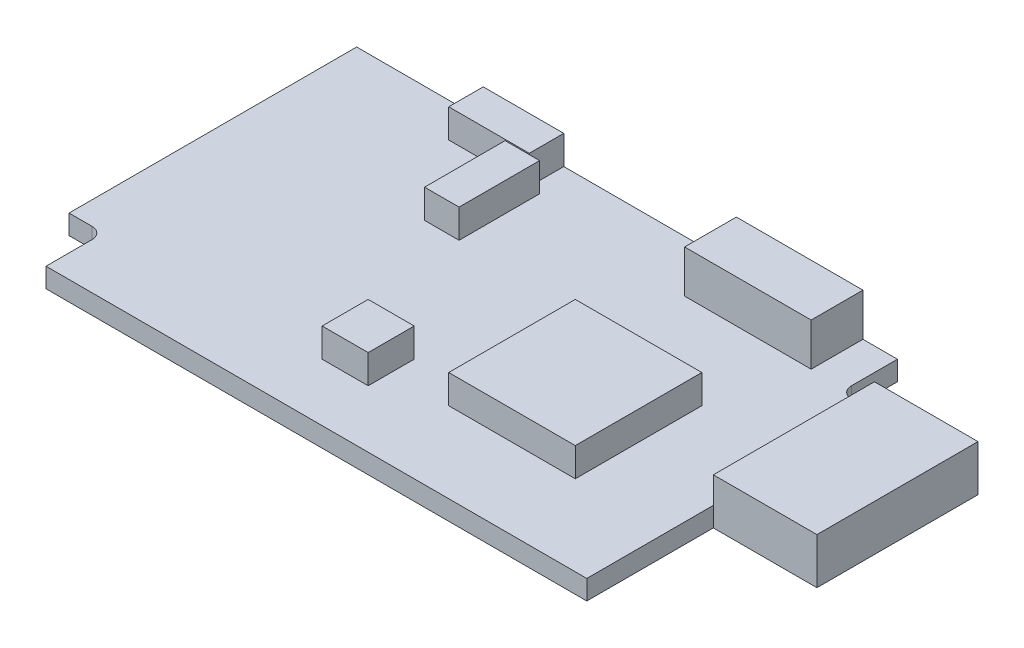
ISO-10303-21;
HEADER;
FILE_DESCRIPTION(('STEP AP214'),'2;1');
FILE_NAME('part.step','',(''),(''),'','','');
FILE_SCHEMA(('AUTOMOTIVE_DESIGN { 1 0 10303 214 1 1 1 1 }'));
ENDSEC;
DATA;
#1=APPLICATION_CONTEXT('core data for automotive mechanical design processes');
#2=APPLICATION_PROTOCOL_DEFINITION('international standard','automotive_design',2000,#1);
#3=PRODUCT_CONTEXT('',#1,'mechanical');
#4=PRODUCT('Part','Part','',(#3));
#5=PRODUCT_RELATED_PRODUCT_CATEGORY('part','',(#4));
#6=PRODUCT_DEFINITION_FORMATION('','',#4);
#7=PRODUCT_DEFINITION_CONTEXT('part definition',#1,'design');
#8=PRODUCT_DEFINITION('design','',#6,#7);
#9=PRODUCT_DEFINITION_SHAPE('','',#8);
#10=(LENGTH_UNIT() NAMED_UNIT(*) SI_UNIT(.MILLI.,.METRE.));
#11=(NAMED_UNIT(*) PLANE_ANGLE_UNIT() SI_UNIT($,.RADIAN.));
#12=(NAMED_UNIT(*) SI_UNIT($,.STERADIAN.) SOLID_ANGLE_UNIT());
#13=UNCERTAINTY_MEASURE_WITH_UNIT(LENGTH_MEASURE(1.E-05),#10,'distance_accuracy_value','');
#14=(GEOMETRIC_REPRESENTATION_CONTEXT(3) GLOBAL_UNCERTAINTY_ASSIGNED_CONTEXT((#13)) GLOBAL_UNIT_ASSIGNED_CONTEXT((#10,
#11,#12)) REPRESENTATION_CONTEXT('',''));
#15=CARTESIAN_POINT('',(0.,0.,0.));
#16=DIRECTION('',(0.,0.,1.));
#17=DIRECTION('',(1.,0.,0.));
#18=AXIS2_PLACEMENT_3D('',#15,#16,#17);
#19=CARTESIAN_POINT('',(50.,1.7,0.));
#20=DIRECTION('',(-1.,0.,0.));
#21=DIRECTION('',(0.,0.,1.));
#22=AXIS2_PLACEMENT_3D('',#19,#20,#21);
#23=PLANE('',#22);
#24=DIRECTION('',(0.,-1.,0.));
#25=VECTOR('',#24,1.);
#26=CARTESIAN_POINT('',(50.,0.,-11.));
#27=LINE('',#26,#25);
#28=CARTESIAN_POINT('',(50.,1.7,-11.));
#29=VERTEX_POINT('',#28);
#30=CARTESIAN_POINT('',(50.,0.,-11.));
#31=VERTEX_POINT('',#30);
#32=EDGE_CURVE('E11',#29,#31,#27,.T.);
#33=ORIENTED_EDGE('',*,*,#32,.F.);
#34=DIRECTION('',(0.,0.,-1.));
#35=VECTOR('',#34,1.);
#36=CARTESIAN_POINT('',(50.,1.7,0.));
#37=LINE('',#36,#35);
#38=CARTESIAN_POINT('',(50.,1.7,0.));
#39=VERTEX_POINT('',#38);
#40=EDGE_CURVE('E293',#39,#29,#37,.T.);
#41=ORIENTED_EDGE('',*,*,#40,.F.);
#42=DIRECTION('',(0.,-1.,0.));
#43=VECTOR('',#42,1.);
#44=CARTESIAN_POINT('',(50.,1.7,0.));
#45=LINE('',#44,#43);
#46=CARTESIAN_POINT('',(50.,0.,0.));
#47=VERTEX_POINT('',#46);
#48=EDGE_CURVE('E366',#39,#47,#45,.T.);
#49=ORIENTED_EDGE('',*,*,#48,.T.);
#50=DIRECTION('',(0.,0.,-1.));
#51=VECTOR('',#50,1.);
#52=CARTESIAN_POINT('',(50.,0.,0.));
#53=LINE('',#52,#51);
#54=EDGE_CURVE('E316',#47,#31,#53,.T.);
#55=ORIENTED_EDGE('',*,*,#54,.T.);
#56=EDGE_LOOP('',(#33,#41,#49,#55));
#57=FACE_BOUND('',#56,.T.);
#58=ADVANCED_FACE('F35',(#57),#23,.F.);
#59=CARTESIAN_POINT('',(47.,1.7,-30.));
#60=DIRECTION('',(0.,-1.,0.));
#61=DIRECTION('',(0.,0.,-1.));
#62=AXIS2_PLACEMENT_3D('',#59,#60,#61);
#63=PLANE('',#62);
#64=DIRECTION('',(0.,0.,1.));
#65=VECTOR('',#64,1.);
#66=CARTESIAN_POINT('',(31.,1.7,-18.));
#67=LINE('',#66,#65);
#68=CARTESIAN_POINT('',(31.,1.7,-18.));
#69=VERTEX_POINT('',#68);
#70=CARTESIAN_POINT('',(31.,1.7,-7.));
#71=VERTEX_POINT('',#70);
#72=EDGE_CURVE('E398',#69,#71,#67,.T.);
#73=ORIENTED_EDGE('',*,*,#72,.F.);
#74=DIRECTION('',(-1.,0.,0.));
#75=VECTOR('',#74,1.);
#76=CARTESIAN_POINT('',(31.,1.7,-18.));
#77=LINE('',#76,#75);
#78=CARTESIAN_POINT('',(42.,1.7,-18.));
#79=VERTEX_POINT('',#78);
#80=EDGE_CURVE('E425',#79,#69,#77,.T.);
#81=ORIENTED_EDGE('',*,*,#80,.F.);
#82=DIRECTION('',(0.,0.,-1.));
#83=VECTOR('',#82,1.);
#84=CARTESIAN_POINT('',(42.,1.7,-18.));
#85=LINE('',#84,#83);
#86=CARTESIAN_POINT('',(42.,1.7,-7.));
#87=VERTEX_POINT('',#86);
#88=EDGE_CURVE('E437',#87,#79,#85,.T.);
#89=ORIENTED_EDGE('',*,*,#88,.F.);
#90=DIRECTION('',(1.,0.,0.));
#91=VECTOR('',#90,1.);
#92=CARTESIAN_POINT('',(31.,1.7,-7.));
#93=LINE('',#92,#91);
#94=EDGE_CURVE('E434',#71,#87,#93,.T.);
#95=ORIENTED_EDGE('',*,*,#94,.F.);
#96=EDGE_LOOP('',(#73,#81,#89,#95));
#97=FACE_BOUND('',#96,.T.);
#98=DIRECTION('',(0.,0.,1.));
#99=VECTOR('',#98,1.);
#100=CARTESIAN_POINT('',(16.,1.7,-26.9));
#101=LINE('',#100,#99);
#102=CARTESIAN_POINT('',(16.,1.7,-26.9));
#103=VERTEX_POINT('',#102);
#104=CARTESIAN_POINT('',(16.,1.7,-19.9));
#105=VERTEX_POINT('',#104);
#106=EDGE_CURVE('E486',#103,#105,#101,.T.);
#107=ORIENTED_EDGE('',*,*,#106,.F.);
#108=DIRECTION('',(-1.,0.,0.));
#109=VECTOR('',#108,1.);
#110=CARTESIAN_POINT('',(16.,1.7,-26.9));
#111=LINE('',#110,#109);
#112=CARTESIAN_POINT('',(19.,1.7,-26.9));
#113=VERTEX_POINT('',#112);
#114=EDGE_CURVE('E491',#113,#103,#111,.T.);
#115=ORIENTED_EDGE('',*,*,#114,.F.);
#116=DIRECTION('',(0.,0.,-1.));
#117=VECTOR('',#116,1.);
#118=CARTESIAN_POINT('',(19.,1.7,-26.9));
#119=LINE('',#118,#117);
#120=CARTESIAN_POINT('',(19.,1.7,-19.9));
#121=VERTEX_POINT('',#120);
#122=EDGE_CURVE('E503',#121,#113,#119,.T.);
#123=ORIENTED_EDGE('',*,*,#122,.F.);
#124=DIRECTION('',(1.,0.,0.));
#125=VECTOR('',#124,1.);
#126=CARTESIAN_POINT('',(16.,1.7,-19.9));
#127=LINE('',#126,#125);
#128=EDGE_CURVE('E500',#105,#121,#127,.T.);
#129=ORIENTED_EDGE('',*,*,#128,.F.);
#130=EDGE_LOOP('',(#107,#115,#123,#129));
#131=FACE_BOUND('',#130,.T.);
#132=DIRECTION('',(0.,0.,1.));
#133=VECTOR('',#132,1.);
#134=CARTESIAN_POINT('',(22.,1.7,-9.));
#135=LINE('',#134,#133);
#136=CARTESIAN_POINT('',(22.,1.7,-9.));
#137=VERTEX_POINT('',#136);
#138=CARTESIAN_POINT('',(22.,1.7,-5.));
#139=VERTEX_POINT('',#138);
#140=EDGE_CURVE('E453',#137,#139,#135,.T.);
#141=ORIENTED_EDGE('',*,*,#140,.F.);
#142=DIRECTION('',(-1.,0.,0.));
#143=VECTOR('',#142,1.);
#144=CARTESIAN_POINT('',(22.,1.7,-9.));
#145=LINE('',#144,#143);
#146=CARTESIAN_POINT('',(26.,1.7,-9.));
#147=VERTEX_POINT('',#146);
#148=EDGE_CURVE('E458',#147,#137,#145,.T.);
#149=ORIENTED_EDGE('',*,*,#148,.F.);
#150=DIRECTION('',(0.,0.,-1.));
#151=VECTOR('',#150,1.);
#152=CARTESIAN_POINT('',(26.,1.7,-9.));
#153=LINE('',#152,#151);
#154=CARTESIAN_POINT('',(26.,1.7,-5.));
#155=VERTEX_POINT('',#154);
#156=EDGE_CURVE('E470',#155,#147,#153,.T.);
#157=ORIENTED_EDGE('',*,*,#156,.F.);
#158=DIRECTION('',(1.,0.,0.));
#159=VECTOR('',#158,1.);
#160=CARTESIAN_POINT('',(22.,1.7,-5.));
#161=LINE('',#160,#159);
#162=EDGE_CURVE('E467',#139,#155,#161,.T.);
#163=ORIENTED_EDGE('',*,*,#162,.F.);
#164=EDGE_LOOP('',(#141,#149,#157,#163));
#165=FACE_BOUND('',#164,.T.);
#166=DIRECTION('',(0.,0.,-1.));
#167=VECTOR('',#166,1.);
#168=CARTESIAN_POINT('',(44.,1.7,-25.5));
#169=LINE('',#168,#167);
#170=CARTESIAN_POINT('',(44.,1.7,-25.5));
#171=VERTEX_POINT('',#170);
#172=CARTESIAN_POINT('',(44.,1.7,-30.));
#173=VERTEX_POINT('',#172);
#174=EDGE_CURVE('E58',#171,#173,#169,.T.);
#175=ORIENTED_EDGE('',*,*,#174,.F.);
#176=DIRECTION('',(1.,0.,0.));
#177=VECTOR('',#176,1.);
#178=CARTESIAN_POINT('',(44.,1.7,-25.5));
#179=LINE('',#178,#177);
#180=CARTESIAN_POINT('',(33.,1.7,-25.5));
#181=VERTEX_POINT('',#180);
#182=EDGE_CURVE('E416',#181,#171,#179,.T.);
#183=ORIENTED_EDGE('',*,*,#182,.F.);
#184=DIRECTION('',(0.,0.,1.));
#185=VECTOR('',#184,1.);
#186=CARTESIAN_POINT('',(33.,1.7,-25.5));
#187=LINE('',#186,#185);
#188=CARTESIAN_POINT('',(33.,1.7,-30.));
#189=VERTEX_POINT('',#188);
#190=EDGE_CURVE('E281',#189,#181,#187,.T.);
#191=ORIENTED_EDGE('',*,*,#190,.F.);
#192=DIRECTION('',(-1.,0.,0.));
#193=VECTOR('',#192,1.);
#194=CARTESIAN_POINT('',(0.,1.7,-30.));
#195=LINE('',#194,#193);
#196=CARTESIAN_POINT('',(18.,1.7,-30.));
#197=VERTEX_POINT('',#196);
#198=EDGE_CURVE('E321',#189,#197,#195,.T.);
#199=ORIENTED_EDGE('',*,*,#198,.T.);
#200=DIRECTION('',(0.,0.,-1.));
#201=VECTOR('',#200,1.);
#202=CARTESIAN_POINT('',(18.,1.7,-30.));
#203=LINE('',#202,#201);
#204=CARTESIAN_POINT('',(18.,1.7,-27.));
#205=VERTEX_POINT('',#204);
#206=EDGE_CURVE('E524',#205,#197,#203,.T.);
#207=ORIENTED_EDGE('',*,*,#206,.F.);
#208=DIRECTION('',(1.,0.,0.));
#209=VECTOR('',#208,1.);
#210=CARTESIAN_POINT('',(11.,1.7,-27.));
#211=LINE('',#210,#209);
#212=CARTESIAN_POINT('',(11.,1.7,-27.));
#213=VERTEX_POINT('',#212);
#214=EDGE_CURVE('E531',#213,#205,#211,.T.);
#215=ORIENTED_EDGE('',*,*,#214,.F.);
#216=DIRECTION('',(0.,0.,1.));
#217=VECTOR('',#216,1.);
#218=CARTESIAN_POINT('',(11.,1.7,-30.));
#219=LINE('',#218,#217);
#220=CARTESIAN_POINT('',(11.,1.7,-30.));
#221=VERTEX_POINT('',#220);
#222=EDGE_CURVE('E519',#221,#213,#219,.T.);
#223=ORIENTED_EDGE('',*,*,#222,.F.);
#224=CARTESIAN_POINT('',(0.,1.7,-30.));
#225=VERTEX_POINT('',#224);
#226=EDGE_CURVE('E325',#221,#225,#195,.T.);
#227=ORIENTED_EDGE('',*,*,#226,.T.);
#228=DIRECTION('',(0.,0.,1.));
#229=VECTOR('',#228,1.);
#230=CARTESIAN_POINT('',(0.,1.7,-5.));
#231=LINE('',#230,#229);
#232=CARTESIAN_POINT('',(0.,1.7,-5.));
#233=VERTEX_POINT('',#232);
#234=EDGE_CURVE('E332',#225,#233,#231,.T.);
#235=ORIENTED_EDGE('',*,*,#234,.T.);
#236=DIRECTION('',(1.,0.,0.));
#237=VECTOR('',#236,1.);
#238=CARTESIAN_POINT('',(0.,1.7,-5.));
#239=LINE('',#238,#237);
#240=CARTESIAN_POINT('',(2.,1.7,-5.));
#241=VERTEX_POINT('',#240);
#242=EDGE_CURVE('E564',#233,#241,#239,.T.);
#243=ORIENTED_EDGE('',*,*,#242,.T.);
#244=CARTESIAN_POINT('',(2.,1.7,-4.));
#245=DIRECTION('',(0.,-1.,0.));
#246=DIRECTION('',(0.,0.,-1.));
#247=AXIS2_PLACEMENT_3D('',#244,#245,#246);
#248=CIRCLE('',#247,1.);
#249=CARTESIAN_POINT('',(3.,1.7,-4.));
#250=VERTEX_POINT('',#249);
#251=EDGE_CURVE('E44',#241,#250,#248,.T.);
#252=ORIENTED_EDGE('',*,*,#251,.T.);
#253=DIRECTION('',(0.,0.,1.));
#254=VECTOR('',#253,1.);
#255=CARTESIAN_POINT('',(3.,1.7,-5.));
#256=LINE('',#255,#254);
#257=CARTESIAN_POINT('',(3.,1.7,0.));
#258=VERTEX_POINT('',#257);
#259=EDGE_CURVE('E565',#250,#258,#256,.T.);
#260=ORIENTED_EDGE('',*,*,#259,.T.);
#261=DIRECTION('',(1.,0.,0.));
#262=VECTOR('',#261,1.);
#263=CARTESIAN_POINT('',(3.,1.7,0.));
#264=LINE('',#263,#262);
#265=EDGE_CURVE('E294',#258,#39,#264,.T.);
#266=ORIENTED_EDGE('',*,*,#265,.T.);
#267=ORIENTED_EDGE('',*,*,#40,.T.);
#268=CARTESIAN_POINT('',(50.,1.7,-25.));
#269=VERTEX_POINT('',#268);
#270=EDGE_CURVE('E291',#29,#269,#37,.T.);
#271=ORIENTED_EDGE('',*,*,#270,.T.);
#272=DIRECTION('',(-1.,0.,0.));
#273=VECTOR('',#272,1.);
#274=CARTESIAN_POINT('',(47.,1.7,-25.));
#275=LINE('',#274,#273);
#276=CARTESIAN_POINT('',(48.,1.7,-25.));
#277=VERTEX_POINT('',#276);
#278=EDGE_CURVE('E295',#269,#277,#275,.T.);
#279=ORIENTED_EDGE('',*,*,#278,.T.);
#280=CARTESIAN_POINT('',(48.,1.7,-26.));
#281=DIRECTION('',(0.,-1.,0.));
#282=DIRECTION('',(0.,0.,-1.));
#283=AXIS2_PLACEMENT_3D('',#280,#281,#282);
#284=CIRCLE('',#283,1.);
#285=CARTESIAN_POINT('',(47.,1.7,-26.));
#286=VERTEX_POINT('',#285);
#287=EDGE_CURVE('E343',#277,#286,#284,.T.);
#288=ORIENTED_EDGE('',*,*,#287,.T.);
#289=DIRECTION('',(0.,0.,-1.));
#290=VECTOR('',#289,1.);
#291=CARTESIAN_POINT('',(47.,1.7,-30.));
#292=LINE('',#291,#290);
#293=CARTESIAN_POINT('',(47.,1.7,-30.));
#294=VERTEX_POINT('',#293);
#295=EDGE_CURVE('E300',#286,#294,#292,.T.);
#296=ORIENTED_EDGE('',*,*,#295,.T.);
#297=EDGE_CURVE('E324',#294,#173,#195,.T.);
#298=ORIENTED_EDGE('',*,*,#297,.T.);
#299=EDGE_LOOP('',(#175,#183,#191,#199,#207,#215,#223,#227,#235,#243,#252,#260,#266,#267,#271,
#279,#288,#296,#298));
#300=FACE_BOUND('',#299,.T.);
#301=ADVANCED_FACE('F385',(#97,#131,#165,#300),#63,.F.);
#302=CARTESIAN_POINT('',(0.,1.7,-30.));
#303=DIRECTION('',(0.,0.,1.));
#304=DIRECTION('',(1.,0.,0.));
#305=AXIS2_PLACEMENT_3D('',#302,#303,#304);
#306=PLANE('',#305);
#307=DIRECTION('',(-1.,0.,0.));
#308=VECTOR('',#307,1.);
#309=CARTESIAN_POINT('',(0.,0.,-30.));
#310=LINE('',#309,#308);
#311=CARTESIAN_POINT('',(47.,0.,-30.));
#312=VERTEX_POINT('',#311);
#313=CARTESIAN_POINT('',(0.,0.,-30.));
#314=VERTEX_POINT('',#313);
#315=EDGE_CURVE('E303',#312,#314,#310,.T.);
#316=ORIENTED_EDGE('',*,*,#315,.T.);
#317=DIRECTION('',(0.,-1.,0.));
#318=VECTOR('',#317,1.);
#319=CARTESIAN_POINT('',(0.,1.7,-30.));
#320=LINE('',#319,#318);
#321=EDGE_CURVE('E357',#225,#314,#320,.T.);
#322=ORIENTED_EDGE('',*,*,#321,.F.);
#323=ORIENTED_EDGE('',*,*,#226,.F.);
#324=DIRECTION('',(0.,-1.,0.));
#325=VECTOR('',#324,1.);
#326=CARTESIAN_POINT('',(11.,4.2,-30.));
#327=LINE('',#326,#325);
#328=CARTESIAN_POINT('',(11.,4.2,-30.));
#329=VERTEX_POINT('',#328);
#330=EDGE_CURVE('E530',#329,#221,#327,.T.);
#331=ORIENTED_EDGE('',*,*,#330,.F.);
#332=DIRECTION('',(-1.,0.,0.));
#333=VECTOR('',#332,1.);
#334=CARTESIAN_POINT('',(11.,4.2,-30.));
#335=LINE('',#334,#333);
#336=CARTESIAN_POINT('',(18.,4.2,-30.));
#337=VERTEX_POINT('',#336);
#338=EDGE_CURVE('E528',#337,#329,#335,.T.);
#339=ORIENTED_EDGE('',*,*,#338,.F.);
#340=DIRECTION('',(0.,-1.,0.));
#341=VECTOR('',#340,1.);
#342=CARTESIAN_POINT('',(18.,4.2,-30.));
#343=LINE('',#342,#341);
#344=EDGE_CURVE('E541',#337,#197,#343,.T.);
#345=ORIENTED_EDGE('',*,*,#344,.T.);
#346=ORIENTED_EDGE('',*,*,#198,.F.);
#347=DIRECTION('',(0.,-1.,0.));
#348=VECTOR('',#347,1.);
#349=CARTESIAN_POINT('',(33.,5.4,-30.));
#350=LINE('',#349,#348);
#351=CARTESIAN_POINT('',(33.,5.4,-30.));
#352=VERTEX_POINT('',#351);
#353=EDGE_CURVE('E399',#352,#189,#350,.T.);
#354=ORIENTED_EDGE('',*,*,#353,.F.);
#355=DIRECTION('',(-1.,0.,0.));
#356=VECTOR('',#355,1.);
#357=CARTESIAN_POINT('',(44.,5.4,-30.));
#358=LINE('',#357,#356);
#359=CARTESIAN_POINT('',(44.,5.4,-30.));
#360=VERTEX_POINT('',#359);
#361=EDGE_CURVE('E394',#360,#352,#358,.T.);
#362=ORIENTED_EDGE('',*,*,#361,.F.);
#363=DIRECTION('',(0.,-1.,0.));
#364=VECTOR('',#363,1.);
#365=CARTESIAN_POINT('',(44.,5.4,-30.));
#366=LINE('',#365,#364);
#367=EDGE_CURVE('E392',#360,#173,#366,.T.);
#368=ORIENTED_EDGE('',*,*,#367,.T.);
#369=ORIENTED_EDGE('',*,*,#297,.F.);
#370=DIRECTION('',(0.,-1.,0.));
#371=VECTOR('',#370,1.);
#372=CARTESIAN_POINT('',(47.,1.7,-30.));
#373=LINE('',#372,#371);
#374=EDGE_CURVE('E302',#294,#312,#373,.T.);
#375=ORIENTED_EDGE('',*,*,#374,.T.);
#376=EDGE_LOOP('',(#316,#322,#323,#331,#339,#345,#346,#354,#362,#368,#369,#375));
#377=FACE_BOUND('',#376,.T.);
#378=ADVANCED_FACE('F390',(#377),#306,.F.);
#379=CARTESIAN_POINT('',(0.,1.7,-5.));
#380=DIRECTION('',(1.,0.,0.));
#381=DIRECTION('',(0.,0.,-1.));
#382=AXIS2_PLACEMENT_3D('',#379,#380,#381);
#383=PLANE('',#382);
#384=DIRECTION('',(0.,0.,1.));
#385=VECTOR('',#384,1.);
#386=CARTESIAN_POINT('',(0.,0.,-5.));
#387=LINE('',#386,#385);
#388=CARTESIAN_POINT('',(0.,0.,-5.));
#389=VERTEX_POINT('',#388);
#390=EDGE_CURVE('E306',#314,#389,#387,.T.);
#391=ORIENTED_EDGE('',*,*,#390,.T.);
#392=DIRECTION('',(0.,-1.,0.));
#393=VECTOR('',#392,1.);
#394=CARTESIAN_POINT('',(0.,1.7,-5.));
#395=LINE('',#394,#393);
#396=EDGE_CURVE('E360',#233,#389,#395,.T.);
#397=ORIENTED_EDGE('',*,*,#396,.F.);
#398=ORIENTED_EDGE('',*,*,#234,.F.);
#399=ORIENTED_EDGE('',*,*,#321,.T.);
#400=EDGE_LOOP('',(#391,#397,#398,#399));
#401=FACE_BOUND('',#400,.T.);
#402=ADVANCED_FACE('F560',(#401),#383,.F.);
#403=CARTESIAN_POINT('',(0.,1.7,-5.));
#404=DIRECTION('',(0.,0.,-1.));
#405=DIRECTION('',(-1.,0.,0.));
#406=AXIS2_PLACEMENT_3D('',#403,#404,#405);
#407=PLANE('',#406);
#408=DIRECTION('',(1.,0.,0.));
#409=VECTOR('',#408,1.);
#410=CARTESIAN_POINT('',(0.,0.,-5.));
#411=LINE('',#410,#409);
#412=CARTESIAN_POINT('',(2.,0.,-5.));
#413=VERTEX_POINT('',#412);
#414=EDGE_CURVE('E309',#389,#413,#411,.T.);
#415=ORIENTED_EDGE('',*,*,#414,.T.);
#416=DIRECTION('',(0.,-1.,0.));
#417=VECTOR('',#416,1.);
#418=CARTESIAN_POINT('',(2.,1.7,-5.));
#419=LINE('',#418,#417);
#420=EDGE_CURVE('E347',#413,#241,#419,.F.);
#421=ORIENTED_EDGE('',*,*,#420,.T.);
#422=ORIENTED_EDGE('',*,*,#242,.F.);
#423=ORIENTED_EDGE('',*,*,#396,.T.);
#424=EDGE_LOOP('',(#415,#421,#422,#423));
#425=FACE_BOUND('',#424,.T.);
#426=ADVANCED_FACE('F590',(#425),#407,.F.);
#427=CARTESIAN_POINT('',(3.,1.7,-5.));
#428=DIRECTION('',(1.,0.,0.));
#429=DIRECTION('',(0.,0.,-1.));
#430=AXIS2_PLACEMENT_3D('',#427,#428,#429);
#431=PLANE('',#430);
#432=ORIENTED_EDGE('',*,*,#259,.F.);
#433=DIRECTION('',(0.,-1.,0.));
#434=VECTOR('',#433,1.);
#435=CARTESIAN_POINT('',(3.,0.,-4.));
#436=LINE('',#435,#434);
#437=CARTESIAN_POINT('',(3.,0.,-4.));
#438=VERTEX_POINT('',#437);
#439=EDGE_CURVE('E349',#250,#438,#436,.T.);
#440=ORIENTED_EDGE('',*,*,#439,.T.);
#441=DIRECTION('',(0.,0.,1.));
#442=VECTOR('',#441,1.);
#443=CARTESIAN_POINT('',(3.,0.,-5.));
#444=LINE('',#443,#442);
#445=CARTESIAN_POINT('',(3.,0.,0.));
#446=VERTEX_POINT('',#445);
#447=EDGE_CURVE('E312',#438,#446,#444,.T.);
#448=ORIENTED_EDGE('',*,*,#447,.T.);
#449=DIRECTION('',(0.,-1.,0.));
#450=VECTOR('',#449,1.);
#451=CARTESIAN_POINT('',(3.,1.7,0.));
#452=LINE('',#451,#450);
#453=EDGE_CURVE('E363',#258,#446,#452,.T.);
#454=ORIENTED_EDGE('',*,*,#453,.F.);
#455=EDGE_LOOP('',(#432,#440,#448,#454));
#456=FACE_BOUND('',#455,.T.);
#457=ADVANCED_FACE('F587',(#456),#431,.F.);
#458=CARTESIAN_POINT('',(3.,1.7,0.));
#459=DIRECTION('',(0.,0.,-1.));
#460=DIRECTION('',(-1.,0.,0.));
#461=AXIS2_PLACEMENT_3D('',#458,#459,#460);
#462=PLANE('',#461);
#463=DIRECTION('',(1.,0.,0.));
#464=VECTOR('',#463,1.);
#465=CARTESIAN_POINT('',(3.,0.,0.));
#466=LINE('',#465,#464);
#467=EDGE_CURVE('E314',#446,#47,#466,.T.);
#468=ORIENTED_EDGE('',*,*,#467,.T.);
#469=ORIENTED_EDGE('',*,*,#48,.F.);
#470=ORIENTED_EDGE('',*,*,#265,.F.);
#471=ORIENTED_EDGE('',*,*,#453,.T.);
#472=EDGE_LOOP('',(#468,#469,#470,#471));
#473=FACE_BOUND('',#472,.T.);
#474=ADVANCED_FACE('F573',(#473),#462,.F.);
#475=CARTESIAN_POINT('',(47.,1.7,-25.));
#476=DIRECTION('',(0.,0.,1.));
#477=DIRECTION('',(1.,0.,0.));
#478=AXIS2_PLACEMENT_3D('',#475,#476,#477);
#479=PLANE('',#478);
#480=DIRECTION('',(-1.,0.,0.));
#481=VECTOR('',#480,1.);
#482=CARTESIAN_POINT('',(47.,0.,-25.));
#483=LINE('',#482,#481);
#484=CARTESIAN_POINT('',(59.,0.,-25.));
#485=VERTEX_POINT('',#484);
#486=CARTESIAN_POINT('',(48.,0.,-25.));
#487=VERTEX_POINT('',#486);
#488=EDGE_CURVE('E262',#485,#487,#483,.T.);
#489=ORIENTED_EDGE('',*,*,#488,.T.);
#490=DIRECTION('',(0.,-1.,0.));
#491=VECTOR('',#490,1.);
#492=CARTESIAN_POINT('',(48.,1.7,-25.));
#493=LINE('',#492,#491);
#494=EDGE_CURVE('E352',#487,#277,#493,.F.);
#495=ORIENTED_EDGE('',*,*,#494,.T.);
#496=ORIENTED_EDGE('',*,*,#278,.F.);
#497=DIRECTION('',(0.,1.,0.));
#498=VECTOR('',#497,1.);
#499=CARTESIAN_POINT('',(50.,0.,-25.));
#500=LINE('',#499,#498);
#501=CARTESIAN_POINT('',(50.,4.,-25.));
#502=VERTEX_POINT('',#501);
#503=EDGE_CURVE('E954',#269,#502,#500,.T.);
#504=ORIENTED_EDGE('',*,*,#503,.T.);
#505=DIRECTION('',(-1.,0.,0.));
#506=VECTOR('',#505,1.);
#507=CARTESIAN_POINT('',(59.,4.,-25.));
#508=LINE('',#507,#506);
#509=CARTESIAN_POINT('',(59.,4.,-25.));
#510=VERTEX_POINT('',#509);
#511=EDGE_CURVE('E279',#510,#502,#508,.T.);
#512=ORIENTED_EDGE('',*,*,#511,.F.);
#513=DIRECTION('',(0.,1.,0.));
#514=VECTOR('',#513,1.);
#515=CARTESIAN_POINT('',(59.,0.,-25.));
#516=LINE('',#515,#514);
#517=EDGE_CURVE('E265',#485,#510,#516,.T.);
#518=ORIENTED_EDGE('',*,*,#517,.F.);
#519=EDGE_LOOP('',(#489,#495,#496,#504,#512,#518));
#520=FACE_BOUND('',#519,.T.);
#521=ADVANCED_FACE('F376',(#520),#479,.F.);
#522=CARTESIAN_POINT('',(47.,1.7,-30.));
#523=DIRECTION('',(-1.,0.,0.));
#524=DIRECTION('',(0.,0.,1.));
#525=AXIS2_PLACEMENT_3D('',#522,#523,#524);
#526=PLANE('',#525);
#527=ORIENTED_EDGE('',*,*,#295,.F.);
#528=DIRECTION('',(0.,-1.,0.));
#529=VECTOR('',#528,1.);
#530=CARTESIAN_POINT('',(47.,0.,-26.));
#531=LINE('',#530,#529);
#532=CARTESIAN_POINT('',(47.,0.,-26.));
#533=VERTEX_POINT('',#532);
#534=EDGE_CURVE('E354',#286,#533,#531,.T.);
#535=ORIENTED_EDGE('',*,*,#534,.T.);
#536=DIRECTION('',(0.,0.,-1.));
#537=VECTOR('',#536,1.);
#538=CARTESIAN_POINT('',(47.,0.,-30.));
#539=LINE('',#538,#537);
#540=EDGE_CURVE('E370',#533,#312,#539,.T.);
#541=ORIENTED_EDGE('',*,*,#540,.T.);
#542=ORIENTED_EDGE('',*,*,#374,.F.);
#543=EDGE_LOOP('',(#527,#535,#541,#542));
#544=FACE_BOUND('',#543,.T.);
#545=ADVANCED_FACE('F386',(#544),#526,.F.);
#546=CARTESIAN_POINT('',(47.,0.,-30.));
#547=DIRECTION('',(0.,-1.,0.));
#548=DIRECTION('',(0.,0.,-1.));
#549=AXIS2_PLACEMENT_3D('',#546,#547,#548);
#550=PLANE('',#549);
#551=ORIENTED_EDGE('',*,*,#315,.F.);
#552=ORIENTED_EDGE('',*,*,#540,.F.);
#553=CARTESIAN_POINT('',(48.,0.,-26.));
#554=DIRECTION('',(0.,-1.,0.));
#555=DIRECTION('',(0.,0.,-1.));
#556=AXIS2_PLACEMENT_3D('',#553,#554,#555);
#557=CIRCLE('',#556,1.);
#558=EDGE_CURVE('E345',#533,#487,#557,.F.);
#559=ORIENTED_EDGE('',*,*,#558,.T.);
#560=ORIENTED_EDGE('',*,*,#488,.F.);
#561=DIRECTION('',(0.,0.,-1.));
#562=VECTOR('',#561,1.);
#563=CARTESIAN_POINT('',(59.,0.,-11.));
#564=LINE('',#563,#562);
#565=CARTESIAN_POINT('',(59.,0.,-11.));
#566=VERTEX_POINT('',#565);
#567=EDGE_CURVE('E254',#566,#485,#564,.T.);
#568=ORIENTED_EDGE('',*,*,#567,.F.);
#569=DIRECTION('',(-1.,0.,0.));
#570=VECTOR('',#569,1.);
#571=CARTESIAN_POINT('',(59.,0.,-11.));
#572=LINE('',#571,#570);
#573=EDGE_CURVE('E260',#566,#31,#572,.T.);
#574=ORIENTED_EDGE('',*,*,#573,.T.);
#575=ORIENTED_EDGE('',*,*,#54,.F.);
#576=ORIENTED_EDGE('',*,*,#467,.F.);
#577=ORIENTED_EDGE('',*,*,#447,.F.);
#578=CARTESIAN_POINT('',(2.,0.,-4.));
#579=DIRECTION('',(0.,-1.,0.));
#580=DIRECTION('',(0.,0.,-1.));
#581=AXIS2_PLACEMENT_3D('',#578,#579,#580);
#582=CIRCLE('',#581,1.);
#583=EDGE_CURVE('E341',#438,#413,#582,.F.);
#584=ORIENTED_EDGE('',*,*,#583,.T.);
#585=ORIENTED_EDGE('',*,*,#414,.F.);
#586=ORIENTED_EDGE('',*,*,#390,.F.);
#587=EDGE_LOOP('',(#551,#552,#559,#560,#568,#574,#575,#576,#577,#584,#585,#586));
#588=FACE_BOUND('',#587,.T.);
#589=ADVANCED_FACE('F257',(#588),#550,.T.);
#590=CARTESIAN_POINT('',(48.,1.7,-26.));
#591=DIRECTION('',(0.,1.,0.));
#592=DIRECTION('',(0.,0.,1.));
#593=AXIS2_PLACEMENT_3D('',#590,#591,#592);
#594=CYLINDRICAL_SURFACE('',#593,1.);
#595=ORIENTED_EDGE('',*,*,#287,.F.);
#596=ORIENTED_EDGE('',*,*,#494,.F.);
#597=ORIENTED_EDGE('',*,*,#558,.F.);
#598=ORIENTED_EDGE('',*,*,#534,.F.);
#599=EDGE_LOOP('',(#595,#596,#597,#598));
#600=FACE_BOUND('',#599,.T.);
#601=ADVANCED_FACE('F382',(#600),#594,.F.);
#602=CARTESIAN_POINT('',(2.,1.7,-4.));
#603=DIRECTION('',(0.,1.,0.));
#604=DIRECTION('',(0.,0.,1.));
#605=AXIS2_PLACEMENT_3D('',#602,#603,#604);
#606=CYLINDRICAL_SURFACE('',#605,1.);
#607=ORIENTED_EDGE('',*,*,#251,.F.);
#608=ORIENTED_EDGE('',*,*,#420,.F.);
#609=ORIENTED_EDGE('',*,*,#583,.F.);
#610=ORIENTED_EDGE('',*,*,#439,.F.);
#611=EDGE_LOOP('',(#607,#608,#609,#610));
#612=FACE_BOUND('',#611,.T.);
#613=ADVANCED_FACE('F37',(#612),#606,.F.);
#614=CARTESIAN_POINT('',(11.,4.2,-30.));
#615=DIRECTION('',(1.,0.,0.));
#616=DIRECTION('',(0.,0.,-1.));
#617=AXIS2_PLACEMENT_3D('',#614,#615,#616);
#618=PLANE('',#617);
#619=ORIENTED_EDGE('',*,*,#222,.T.);
#620=DIRECTION('',(0.,-1.,0.));
#621=VECTOR('',#620,1.);
#622=CARTESIAN_POINT('',(11.,4.2,-27.));
#623=LINE('',#622,#621);
#624=CARTESIAN_POINT('',(11.,4.2,-27.));
#625=VERTEX_POINT('',#624);
#626=EDGE_CURVE('E307',#625,#213,#623,.T.);
#627=ORIENTED_EDGE('',*,*,#626,.F.);
#628=DIRECTION('',(0.,0.,1.));
#629=VECTOR('',#628,1.);
#630=CARTESIAN_POINT('',(11.,4.2,-30.));
#631=LINE('',#630,#629);
#632=EDGE_CURVE('E520',#329,#625,#631,.T.);
#633=ORIENTED_EDGE('',*,*,#632,.F.);
#634=ORIENTED_EDGE('',*,*,#330,.T.);
#635=EDGE_LOOP('',(#619,#627,#633,#634));
#636=FACE_BOUND('',#635,.T.);
#637=ADVANCED_FACE('F554',(#636),#618,.F.);
#638=CARTESIAN_POINT('',(11.,4.2,-27.));
#639=DIRECTION('',(0.,0.,-1.));
#640=DIRECTION('',(-1.,0.,0.));
#641=AXIS2_PLACEMENT_3D('',#638,#639,#640);
#642=PLANE('',#641);
#643=ORIENTED_EDGE('',*,*,#214,.T.);
#644=DIRECTION('',(0.,-1.,0.));
#645=VECTOR('',#644,1.);
#646=CARTESIAN_POINT('',(18.,4.2,-27.));
#647=LINE('',#646,#645);
#648=CARTESIAN_POINT('',(18.,4.2,-27.));
#649=VERTEX_POINT('',#648);
#650=EDGE_CURVE('E535',#649,#205,#647,.T.);
#651=ORIENTED_EDGE('',*,*,#650,.F.);
#652=DIRECTION('',(1.,0.,0.));
#653=VECTOR('',#652,1.);
#654=CARTESIAN_POINT('',(11.,4.2,-27.));
#655=LINE('',#654,#653);
#656=EDGE_CURVE('E523',#625,#649,#655,.T.);
#657=ORIENTED_EDGE('',*,*,#656,.F.);
#658=ORIENTED_EDGE('',*,*,#626,.T.);
#659=EDGE_LOOP('',(#643,#651,#657,#658));
#660=FACE_BOUND('',#659,.T.);
#661=ADVANCED_FACE('F611',(#660),#642,.F.);
#662=CARTESIAN_POINT('',(18.,4.2,-30.));
#663=DIRECTION('',(-1.,0.,0.));
#664=DIRECTION('',(0.,0.,1.));
#665=AXIS2_PLACEMENT_3D('',#662,#663,#664);
#666=PLANE('',#665);
#667=ORIENTED_EDGE('',*,*,#206,.T.);
#668=ORIENTED_EDGE('',*,*,#344,.F.);
#669=DIRECTION('',(0.,0.,-1.));
#670=VECTOR('',#669,1.);
#671=CARTESIAN_POINT('',(18.,4.2,-30.));
#672=LINE('',#671,#670);
#673=EDGE_CURVE('E526',#649,#337,#672,.T.);
#674=ORIENTED_EDGE('',*,*,#673,.F.);
#675=ORIENTED_EDGE('',*,*,#650,.T.);
#676=EDGE_LOOP('',(#667,#668,#674,#675));
#677=FACE_BOUND('',#676,.T.);
#678=ADVANCED_FACE('F614',(#677),#666,.F.);
#679=CARTESIAN_POINT('',(11.,4.2,-27.));
#680=DIRECTION('',(0.,1.,0.));
#681=DIRECTION('',(0.,0.,1.));
#682=AXIS2_PLACEMENT_3D('',#679,#680,#681);
#683=PLANE('',#682);
#684=ORIENTED_EDGE('',*,*,#632,.T.);
#685=ORIENTED_EDGE('',*,*,#656,.T.);
#686=ORIENTED_EDGE('',*,*,#673,.T.);
#687=ORIENTED_EDGE('',*,*,#338,.T.);
#688=EDGE_LOOP('',(#684,#685,#686,#687));
#689=FACE_BOUND('',#688,.T.);
#690=ADVANCED_FACE('F618',(#689),#683,.T.);
#691=CARTESIAN_POINT('',(16.,4.2,-26.9));
#692=DIRECTION('',(1.,0.,0.));
#693=DIRECTION('',(0.,0.,-1.));
#694=AXIS2_PLACEMENT_3D('',#691,#692,#693);
#695=PLANE('',#694);
#696=ORIENTED_EDGE('',*,*,#106,.T.);
#697=DIRECTION('',(0.,-1.,0.));
#698=VECTOR('',#697,1.);
#699=CARTESIAN_POINT('',(16.,4.2,-19.9));
#700=LINE('',#699,#698);
#701=CARTESIAN_POINT('',(16.,4.2,-19.9));
#702=VERTEX_POINT('',#701);
#703=EDGE_CURVE('E516',#702,#105,#700,.T.);
#704=ORIENTED_EDGE('',*,*,#703,.F.);
#705=DIRECTION('',(0.,0.,1.));
#706=VECTOR('',#705,1.);
#707=CARTESIAN_POINT('',(16.,4.2,-26.9));
#708=LINE('',#707,#706);
#709=CARTESIAN_POINT('',(16.,4.2,-26.9));
#710=VERTEX_POINT('',#709);
#711=EDGE_CURVE('E487',#710,#702,#708,.T.);
#712=ORIENTED_EDGE('',*,*,#711,.F.);
#713=DIRECTION('',(0.,-1.,0.));
#714=VECTOR('',#713,1.);
#715=CARTESIAN_POINT('',(16.,4.2,-26.9));
#716=LINE('',#715,#714);
#717=EDGE_CURVE('E497',#710,#103,#716,.T.);
#718=ORIENTED_EDGE('',*,*,#717,.T.);
#719=EDGE_LOOP('',(#696,#704,#712,#718));
#720=FACE_BOUND('',#719,.T.);
#721=ADVANCED_FACE('F622',(#720),#695,.F.);
#722=CARTESIAN_POINT('',(16.,4.2,-19.9));
#723=DIRECTION('',(0.,0.,-1.));
#724=DIRECTION('',(-1.,0.,0.));
#725=AXIS2_PLACEMENT_3D('',#722,#723,#724);
#726=PLANE('',#725);
#727=ORIENTED_EDGE('',*,*,#128,.T.);
#728=DIRECTION('',(0.,-1.,0.));
#729=VECTOR('',#728,1.);
#730=CARTESIAN_POINT('',(19.,4.2,-19.9));
#731=LINE('',#730,#729);
#732=CARTESIAN_POINT('',(19.,4.2,-19.9));
#733=VERTEX_POINT('',#732);
#734=EDGE_CURVE('E513',#733,#121,#731,.T.);
#735=ORIENTED_EDGE('',*,*,#734,.F.);
#736=DIRECTION('',(1.,0.,0.));
#737=VECTOR('',#736,1.);
#738=CARTESIAN_POINT('',(16.,4.2,-19.9));
#739=LINE('',#738,#737);
#740=EDGE_CURVE('E490',#702,#733,#739,.T.);
#741=ORIENTED_EDGE('',*,*,#740,.F.);
#742=ORIENTED_EDGE('',*,*,#703,.T.);
#743=EDGE_LOOP('',(#727,#735,#741,#742));
#744=FACE_BOUND('',#743,.T.);
#745=ADVANCED_FACE('F626',(#744),#726,.F.);
#746=CARTESIAN_POINT('',(19.,4.2,-26.9));
#747=DIRECTION('',(-1.,0.,0.));
#748=DIRECTION('',(0.,0.,1.));
#749=AXIS2_PLACEMENT_3D('',#746,#747,#748);
#750=PLANE('',#749);
#751=ORIENTED_EDGE('',*,*,#122,.T.);
#752=DIRECTION('',(0.,-1.,0.));
#753=VECTOR('',#752,1.);
#754=CARTESIAN_POINT('',(19.,4.2,-26.9));
#755=LINE('',#754,#753);
#756=CARTESIAN_POINT('',(19.,4.2,-26.9));
#757=VERTEX_POINT('',#756);
#758=EDGE_CURVE('E510',#757,#113,#755,.T.);
#759=ORIENTED_EDGE('',*,*,#758,.F.);
#760=DIRECTION('',(0.,0.,-1.));
#761=VECTOR('',#760,1.);
#762=CARTESIAN_POINT('',(19.,4.2,-26.9));
#763=LINE('',#762,#761);
#764=EDGE_CURVE('E493',#733,#757,#763,.T.);
#765=ORIENTED_EDGE('',*,*,#764,.F.);
#766=ORIENTED_EDGE('',*,*,#734,.T.);
#767=EDGE_LOOP('',(#751,#759,#765,#766));
#768=FACE_BOUND('',#767,.T.);
#769=ADVANCED_FACE('F630',(#768),#750,.F.);
#770=CARTESIAN_POINT('',(16.,4.2,-26.9));
#771=DIRECTION('',(0.,0.,1.));
#772=DIRECTION('',(1.,0.,0.));
#773=AXIS2_PLACEMENT_3D('',#770,#771,#772);
#774=PLANE('',#773);
#775=ORIENTED_EDGE('',*,*,#114,.T.);
#776=ORIENTED_EDGE('',*,*,#717,.F.);
#777=DIRECTION('',(-1.,0.,0.));
#778=VECTOR('',#777,1.);
#779=CARTESIAN_POINT('',(16.,4.2,-26.9));
#780=LINE('',#779,#778);
#781=EDGE_CURVE('E495',#757,#710,#780,.T.);
#782=ORIENTED_EDGE('',*,*,#781,.F.);
#783=ORIENTED_EDGE('',*,*,#758,.T.);
#784=EDGE_LOOP('',(#775,#776,#782,#783));
#785=FACE_BOUND('',#784,.T.);
#786=ADVANCED_FACE('F634',(#785),#774,.F.);
#787=CARTESIAN_POINT('',(16.,4.2,-19.9));
#788=DIRECTION('',(0.,1.,0.));
#789=DIRECTION('',(0.,0.,1.));
#790=AXIS2_PLACEMENT_3D('',#787,#788,#789);
#791=PLANE('',#790);
#792=ORIENTED_EDGE('',*,*,#711,.T.);
#793=ORIENTED_EDGE('',*,*,#740,.T.);
#794=ORIENTED_EDGE('',*,*,#764,.T.);
#795=ORIENTED_EDGE('',*,*,#781,.T.);
#796=EDGE_LOOP('',(#792,#793,#794,#795));
#797=FACE_BOUND('',#796,.T.);
#798=ADVANCED_FACE('F638',(#797),#791,.T.);
#799=CARTESIAN_POINT('',(22.,4.2,-9.));
#800=DIRECTION('',(1.,0.,0.));
#801=DIRECTION('',(0.,0.,-1.));
#802=AXIS2_PLACEMENT_3D('',#799,#800,#801);
#803=PLANE('',#802);
#804=ORIENTED_EDGE('',*,*,#140,.T.);
#805=DIRECTION('',(0.,-1.,0.));
#806=VECTOR('',#805,1.);
#807=CARTESIAN_POINT('',(22.,4.2,-5.));
#808=LINE('',#807,#806);
#809=CARTESIAN_POINT('',(22.,4.2,-5.));
#810=VERTEX_POINT('',#809);
#811=EDGE_CURVE('E483',#810,#139,#808,.T.);
#812=ORIENTED_EDGE('',*,*,#811,.F.);
#813=DIRECTION('',(0.,0.,1.));
#814=VECTOR('',#813,1.);
#815=CARTESIAN_POINT('',(22.,4.2,-9.));
#816=LINE('',#815,#814);
#817=CARTESIAN_POINT('',(22.,4.2,-9.));
#818=VERTEX_POINT('',#817);
#819=EDGE_CURVE('E454',#818,#810,#816,.T.);
#820=ORIENTED_EDGE('',*,*,#819,.F.);
#821=DIRECTION('',(0.,-1.,0.));
#822=VECTOR('',#821,1.);
#823=CARTESIAN_POINT('',(22.,4.2,-9.));
#824=LINE('',#823,#822);
#825=EDGE_CURVE('E464',#818,#137,#824,.T.);
#826=ORIENTED_EDGE('',*,*,#825,.T.);
#827=EDGE_LOOP('',(#804,#812,#820,#826));
#828=FACE_BOUND('',#827,.T.);
#829=ADVANCED_FACE('F642',(#828),#803,.F.);
#830=CARTESIAN_POINT('',(22.,4.2,-5.));
#831=DIRECTION('',(0.,0.,-1.));
#832=DIRECTION('',(-1.,0.,0.));
#833=AXIS2_PLACEMENT_3D('',#830,#831,#832);
#834=PLANE('',#833);
#835=ORIENTED_EDGE('',*,*,#162,.T.);
#836=DIRECTION('',(0.,-1.,0.));
#837=VECTOR('',#836,1.);
#838=CARTESIAN_POINT('',(26.,4.2,-5.));
#839=LINE('',#838,#837);
#840=CARTESIAN_POINT('',(26.,4.2,-5.));
#841=VERTEX_POINT('',#840);
#842=EDGE_CURVE('E480',#841,#155,#839,.T.);
#843=ORIENTED_EDGE('',*,*,#842,.F.);
#844=DIRECTION('',(1.,0.,0.));
#845=VECTOR('',#844,1.);
#846=CARTESIAN_POINT('',(22.,4.2,-5.));
#847=LINE('',#846,#845);
#848=EDGE_CURVE('E457',#810,#841,#847,.T.);
#849=ORIENTED_EDGE('',*,*,#848,.F.);
#850=ORIENTED_EDGE('',*,*,#811,.T.);
#851=EDGE_LOOP('',(#835,#843,#849,#850));
#852=FACE_BOUND('',#851,.T.);
#853=ADVANCED_FACE('F646',(#852),#834,.F.);
#854=CARTESIAN_POINT('',(26.,4.2,-9.));
#855=DIRECTION('',(-1.,0.,0.));
#856=DIRECTION('',(0.,0.,1.));
#857=AXIS2_PLACEMENT_3D('',#854,#855,#856);
#858=PLANE('',#857);
#859=ORIENTED_EDGE('',*,*,#156,.T.);
#860=DIRECTION('',(0.,-1.,0.));
#861=VECTOR('',#860,1.);
#862=CARTESIAN_POINT('',(26.,4.2,-9.));
#863=LINE('',#862,#861);
#864=CARTESIAN_POINT('',(26.,4.2,-9.));
#865=VERTEX_POINT('',#864);
#866=EDGE_CURVE('E477',#865,#147,#863,.T.);
#867=ORIENTED_EDGE('',*,*,#866,.F.);
#868=DIRECTION('',(0.,0.,-1.));
#869=VECTOR('',#868,1.);
#870=CARTESIAN_POINT('',(26.,4.2,-9.));
#871=LINE('',#870,#869);
#872=EDGE_CURVE('E460',#841,#865,#871,.T.);
#873=ORIENTED_EDGE('',*,*,#872,.F.);
#874=ORIENTED_EDGE('',*,*,#842,.T.);
#875=EDGE_LOOP('',(#859,#867,#873,#874));
#876=FACE_BOUND('',#875,.T.);
#877=ADVANCED_FACE('F650',(#876),#858,.F.);
#878=CARTESIAN_POINT('',(22.,4.2,-9.));
#879=DIRECTION('',(0.,0.,1.));
#880=DIRECTION('',(1.,0.,0.));
#881=AXIS2_PLACEMENT_3D('',#878,#879,#880);
#882=PLANE('',#881);
#883=ORIENTED_EDGE('',*,*,#148,.T.);
#884=ORIENTED_EDGE('',*,*,#825,.F.);
#885=DIRECTION('',(-1.,0.,0.));
#886=VECTOR('',#885,1.);
#887=CARTESIAN_POINT('',(22.,4.2,-9.));
#888=LINE('',#887,#886);
#889=EDGE_CURVE('E462',#865,#818,#888,.T.);
#890=ORIENTED_EDGE('',*,*,#889,.F.);
#891=ORIENTED_EDGE('',*,*,#866,.T.);
#892=EDGE_LOOP('',(#883,#884,#890,#891));
#893=FACE_BOUND('',#892,.T.);
#894=ADVANCED_FACE('F654',(#893),#882,.F.);
#895=CARTESIAN_POINT('',(22.,4.2,-5.));
#896=DIRECTION('',(0.,1.,0.));
#897=DIRECTION('',(0.,0.,1.));
#898=AXIS2_PLACEMENT_3D('',#895,#896,#897);
#899=PLANE('',#898);
#900=ORIENTED_EDGE('',*,*,#819,.T.);
#901=ORIENTED_EDGE('',*,*,#848,.T.);
#902=ORIENTED_EDGE('',*,*,#872,.T.);
#903=ORIENTED_EDGE('',*,*,#889,.T.);
#904=EDGE_LOOP('',(#900,#901,#902,#903));
#905=FACE_BOUND('',#904,.T.);
#906=ADVANCED_FACE('F658',(#905),#899,.T.);
#907=CARTESIAN_POINT('',(31.,4.2,-18.));
#908=DIRECTION('',(1.,0.,0.));
#909=DIRECTION('',(0.,0.,-1.));
#910=AXIS2_PLACEMENT_3D('',#907,#908,#909);
#911=PLANE('',#910);
#912=ORIENTED_EDGE('',*,*,#72,.T.);
#913=DIRECTION('',(0.,-1.,0.));
#914=VECTOR('',#913,1.);
#915=CARTESIAN_POINT('',(31.,4.2,-7.));
#916=LINE('',#915,#914);
#917=CARTESIAN_POINT('',(31.,4.2,-7.));
#918=VERTEX_POINT('',#917);
#919=EDGE_CURVE('E450',#918,#71,#916,.T.);
#920=ORIENTED_EDGE('',*,*,#919,.F.);
#921=DIRECTION('',(0.,0.,1.));
#922=VECTOR('',#921,1.);
#923=CARTESIAN_POINT('',(31.,4.2,-18.));
#924=LINE('',#923,#922);
#925=CARTESIAN_POINT('',(31.,4.2,-18.));
#926=VERTEX_POINT('',#925);
#927=EDGE_CURVE('E421',#926,#918,#924,.T.);
#928=ORIENTED_EDGE('',*,*,#927,.F.);
#929=DIRECTION('',(0.,-1.,0.));
#930=VECTOR('',#929,1.);
#931=CARTESIAN_POINT('',(31.,4.2,-18.));
#932=LINE('',#931,#930);
#933=EDGE_CURVE('E431',#926,#69,#932,.T.);
#934=ORIENTED_EDGE('',*,*,#933,.T.);
#935=EDGE_LOOP('',(#912,#920,#928,#934));
#936=FACE_BOUND('',#935,.T.);
#937=ADVANCED_FACE('F662',(#936),#911,.F.);
#938=CARTESIAN_POINT('',(31.,4.2,-7.));
#939=DIRECTION('',(0.,0.,-1.));
#940=DIRECTION('',(-1.,0.,0.));
#941=AXIS2_PLACEMENT_3D('',#938,#939,#940);
#942=PLANE('',#941);
#943=ORIENTED_EDGE('',*,*,#94,.T.);
#944=DIRECTION('',(0.,-1.,0.));
#945=VECTOR('',#944,1.);
#946=CARTESIAN_POINT('',(42.,4.2,-7.));
#947=LINE('',#946,#945);
#948=CARTESIAN_POINT('',(42.,4.2,-7.));
#949=VERTEX_POINT('',#948);
#950=EDGE_CURVE('E447',#949,#87,#947,.T.);
#951=ORIENTED_EDGE('',*,*,#950,.F.);
#952=DIRECTION('',(1.,0.,0.));
#953=VECTOR('',#952,1.);
#954=CARTESIAN_POINT('',(31.,4.2,-7.));
#955=LINE('',#954,#953);
#956=EDGE_CURVE('E424',#918,#949,#955,.T.);
#957=ORIENTED_EDGE('',*,*,#956,.F.);
#958=ORIENTED_EDGE('',*,*,#919,.T.);
#959=EDGE_LOOP('',(#943,#951,#957,#958));
#960=FACE_BOUND('',#959,.T.);
#961=ADVANCED_FACE('F666',(#960),#942,.F.);
#962=CARTESIAN_POINT('',(42.,4.2,-18.));
#963=DIRECTION('',(-1.,0.,0.));
#964=DIRECTION('',(0.,0.,1.));
#965=AXIS2_PLACEMENT_3D('',#962,#963,#964);
#966=PLANE('',#965);
#967=ORIENTED_EDGE('',*,*,#88,.T.);
#968=DIRECTION('',(0.,-1.,0.));
#969=VECTOR('',#968,1.);
#970=CARTESIAN_POINT('',(42.,4.2,-18.));
#971=LINE('',#970,#969);
#972=CARTESIAN_POINT('',(42.,4.2,-18.));
#973=VERTEX_POINT('',#972);
#974=EDGE_CURVE('E444',#973,#79,#971,.T.);
#975=ORIENTED_EDGE('',*,*,#974,.F.);
#976=DIRECTION('',(0.,0.,-1.));
#977=VECTOR('',#976,1.);
#978=CARTESIAN_POINT('',(42.,4.2,-18.));
#979=LINE('',#978,#977);
#980=EDGE_CURVE('E427',#949,#973,#979,.T.);
#981=ORIENTED_EDGE('',*,*,#980,.F.);
#982=ORIENTED_EDGE('',*,*,#950,.T.);
#983=EDGE_LOOP('',(#967,#975,#981,#982));
#984=FACE_BOUND('',#983,.T.);
#985=ADVANCED_FACE('F670',(#984),#966,.F.);
#986=CARTESIAN_POINT('',(31.,4.2,-18.));
#987=DIRECTION('',(0.,0.,1.));
#988=DIRECTION('',(1.,0.,0.));
#989=AXIS2_PLACEMENT_3D('',#986,#987,#988);
#990=PLANE('',#989);
#991=ORIENTED_EDGE('',*,*,#80,.T.);
#992=ORIENTED_EDGE('',*,*,#933,.F.);
#993=DIRECTION('',(-1.,0.,0.));
#994=VECTOR('',#993,1.);
#995=CARTESIAN_POINT('',(31.,4.2,-18.));
#996=LINE('',#995,#994);
#997=EDGE_CURVE('E429',#973,#926,#996,.T.);
#998=ORIENTED_EDGE('',*,*,#997,.F.);
#999=ORIENTED_EDGE('',*,*,#974,.T.);
#1000=EDGE_LOOP('',(#991,#992,#998,#999));
#1001=FACE_BOUND('',#1000,.T.);
#1002=ADVANCED_FACE('F674',(#1001),#990,.F.);
#1003=CARTESIAN_POINT('',(31.,4.2,-7.));
#1004=DIRECTION('',(0.,1.,0.));
#1005=DIRECTION('',(0.,0.,1.));
#1006=AXIS2_PLACEMENT_3D('',#1003,#1004,#1005);
#1007=PLANE('',#1006);
#1008=ORIENTED_EDGE('',*,*,#927,.T.);
#1009=ORIENTED_EDGE('',*,*,#956,.T.);
#1010=ORIENTED_EDGE('',*,*,#980,.T.);
#1011=ORIENTED_EDGE('',*,*,#997,.T.);
#1012=EDGE_LOOP('',(#1008,#1009,#1010,#1011));
#1013=FACE_BOUND('',#1012,.T.);
#1014=ADVANCED_FACE('F678',(#1013),#1007,.T.);
#1015=CARTESIAN_POINT('',(44.,5.4,-25.5));
#1016=DIRECTION('',(-1.,0.,0.));
#1017=DIRECTION('',(0.,0.,1.));
#1018=AXIS2_PLACEMENT_3D('',#1015,#1016,#1017);
#1019=PLANE('',#1018);
#1020=ORIENTED_EDGE('',*,*,#174,.T.);
#1021=ORIENTED_EDGE('',*,*,#367,.F.);
#1022=DIRECTION('',(0.,0.,-1.));
#1023=VECTOR('',#1022,1.);
#1024=CARTESIAN_POINT('',(44.,5.4,-25.5));
#1025=LINE('',#1024,#1023);
#1026=CARTESIAN_POINT('',(44.,5.4,-25.5));
#1027=VERTEX_POINT('',#1026);
#1028=EDGE_CURVE('E405',#1027,#360,#1025,.T.);
#1029=ORIENTED_EDGE('',*,*,#1028,.F.);
#1030=DIRECTION('',(0.,-1.,0.));
#1031=VECTOR('',#1030,1.);
#1032=CARTESIAN_POINT('',(44.,5.4,-25.5));
#1033=LINE('',#1032,#1031);
#1034=EDGE_CURVE('E404',#1027,#171,#1033,.T.);
#1035=ORIENTED_EDGE('',*,*,#1034,.T.);
#1036=EDGE_LOOP('',(#1020,#1021,#1029,#1035));
#1037=FACE_BOUND('',#1036,.T.);
#1038=ADVANCED_FACE('F402',(#1037),#1019,.F.);
#1039=CARTESIAN_POINT('',(33.,5.4,-25.5));
#1040=DIRECTION('',(1.,0.,0.));
#1041=DIRECTION('',(0.,0.,-1.));
#1042=AXIS2_PLACEMENT_3D('',#1039,#1040,#1041);
#1043=PLANE('',#1042);
#1044=ORIENTED_EDGE('',*,*,#190,.T.);
#1045=DIRECTION('',(0.,-1.,0.));
#1046=VECTOR('',#1045,1.);
#1047=CARTESIAN_POINT('',(33.,5.4,-25.5));
#1048=LINE('',#1047,#1046);
#1049=CARTESIAN_POINT('',(33.,5.4,-25.5));
#1050=VERTEX_POINT('',#1049);
#1051=EDGE_CURVE('E408',#1050,#181,#1048,.T.);
#1052=ORIENTED_EDGE('',*,*,#1051,.F.);
#1053=DIRECTION('',(0.,0.,1.));
#1054=VECTOR('',#1053,1.);
#1055=CARTESIAN_POINT('',(33.,5.4,-25.5));
#1056=LINE('',#1055,#1054);
#1057=EDGE_CURVE('E413',#352,#1050,#1056,.T.);
#1058=ORIENTED_EDGE('',*,*,#1057,.F.);
#1059=ORIENTED_EDGE('',*,*,#353,.T.);
#1060=EDGE_LOOP('',(#1044,#1052,#1058,#1059));
#1061=FACE_BOUND('',#1060,.T.);
#1062=ADVANCED_FACE('F685',(#1061),#1043,.F.);
#1063=CARTESIAN_POINT('',(44.,5.4,-25.5));
#1064=DIRECTION('',(0.,0.,-1.));
#1065=DIRECTION('',(-1.,0.,0.));
#1066=AXIS2_PLACEMENT_3D('',#1063,#1064,#1065);
#1067=PLANE('',#1066);
#1068=ORIENTED_EDGE('',*,*,#182,.T.);
#1069=ORIENTED_EDGE('',*,*,#1034,.F.);
#1070=DIRECTION('',(1.,0.,0.));
#1071=VECTOR('',#1070,1.);
#1072=CARTESIAN_POINT('',(44.,5.4,-25.5));
#1073=LINE('',#1072,#1071);
#1074=EDGE_CURVE('E409',#1050,#1027,#1073,.T.);
#1075=ORIENTED_EDGE('',*,*,#1074,.F.);
#1076=ORIENTED_EDGE('',*,*,#1051,.T.);
#1077=EDGE_LOOP('',(#1068,#1069,#1075,#1076));
#1078=FACE_BOUND('',#1077,.T.);
#1079=ADVANCED_FACE('F688',(#1078),#1067,.F.);
#1080=CARTESIAN_POINT('',(44.,5.4,-30.));
#1081=DIRECTION('',(0.,1.,0.));
#1082=DIRECTION('',(0.,0.,1.));
#1083=AXIS2_PLACEMENT_3D('',#1080,#1081,#1082);
#1084=PLANE('',#1083);
#1085=ORIENTED_EDGE('',*,*,#1028,.T.);
#1086=ORIENTED_EDGE('',*,*,#361,.T.);
#1087=ORIENTED_EDGE('',*,*,#1057,.T.);
#1088=ORIENTED_EDGE('',*,*,#1074,.T.);
#1089=EDGE_LOOP('',(#1085,#1086,#1087,#1088));
#1090=FACE_BOUND('',#1089,.T.);
#1091=ADVANCED_FACE('F692',(#1090),#1084,.T.);
#1092=CARTESIAN_POINT('',(50.,4.,-11.));
#1093=DIRECTION('',(-1.,0.,0.));
#1094=DIRECTION('',(0.,0.,1.));
#1095=AXIS2_PLACEMENT_3D('',#1092,#1093,#1094);
#1096=PLANE('',#1095);
#1097=ORIENTED_EDGE('',*,*,#270,.F.);
#1098=CARTESIAN_POINT('',(50.,4.,-11.));
#1099=VERTEX_POINT('',#1098);
#1100=EDGE_CURVE('E953',#1099,#29,#27,.T.);
#1101=ORIENTED_EDGE('',*,*,#1100,.F.);
#1102=DIRECTION('',(0.,0.,1.));
#1103=VECTOR('',#1102,1.);
#1104=CARTESIAN_POINT('',(50.,4.,-11.));
#1105=LINE('',#1104,#1103);
#1106=EDGE_CURVE('E275',#502,#1099,#1105,.T.);
#1107=ORIENTED_EDGE('',*,*,#1106,.F.);
#1108=ORIENTED_EDGE('',*,*,#503,.F.);
#1109=EDGE_LOOP('',(#1097,#1101,#1107,#1108));
#1110=FACE_BOUND('',#1109,.T.);
#1111=ADVANCED_FACE('F695',(#1110),#1096,.T.);
#1112=CARTESIAN_POINT('',(59.,0.,-11.));
#1113=DIRECTION('',(0.,0.,-1.));
#1114=DIRECTION('',(0.,1.,0.));
#1115=AXIS2_PLACEMENT_3D('',#1112,#1113,#1114);
#1116=PLANE('',#1115);
#1117=ORIENTED_EDGE('',*,*,#1100,.T.);
#1118=ORIENTED_EDGE('',*,*,#32,.T.);
#1119=ORIENTED_EDGE('',*,*,#573,.F.);
#1120=DIRECTION('',(0.,-1.,0.));
#1121=VECTOR('',#1120,1.);
#1122=CARTESIAN_POINT('',(59.,0.,-11.));
#1123=LINE('',#1122,#1121);
#1124=CARTESIAN_POINT('',(59.,4.,-11.));
#1125=VERTEX_POINT('',#1124);
#1126=EDGE_CURVE('E266',#1125,#566,#1123,.T.);
#1127=ORIENTED_EDGE('',*,*,#1126,.F.);
#1128=DIRECTION('',(-1.,0.,0.));
#1129=VECTOR('',#1128,1.);
#1130=CARTESIAN_POINT('',(59.,4.,-11.));
#1131=LINE('',#1130,#1129);
#1132=EDGE_CURVE('E284',#1125,#1099,#1131,.T.);
#1133=ORIENTED_EDGE('',*,*,#1132,.T.);
#1134=EDGE_LOOP('',(#1117,#1118,#1119,#1127,#1133));
#1135=FACE_BOUND('',#1134,.T.);
#1136=ADVANCED_FACE('F278',(#1135),#1116,.F.);
#1137=CARTESIAN_POINT('',(59.,4.,-11.));
#1138=DIRECTION('',(0.,-1.,0.));
#1139=DIRECTION('',(0.,0.,-1.));
#1140=AXIS2_PLACEMENT_3D('',#1137,#1138,#1139);
#1141=PLANE('',#1140);
#1142=ORIENTED_EDGE('',*,*,#1106,.T.);
#1143=ORIENTED_EDGE('',*,*,#1132,.F.);
#1144=DIRECTION('',(0.,0.,1.));
#1145=VECTOR('',#1144,1.);
#1146=CARTESIAN_POINT('',(59.,4.,-11.));
#1147=LINE('',#1146,#1145);
#1148=EDGE_CURVE('E271',#510,#1125,#1147,.T.);
#1149=ORIENTED_EDGE('',*,*,#1148,.F.);
#1150=ORIENTED_EDGE('',*,*,#511,.T.);
#1151=EDGE_LOOP('',(#1142,#1143,#1149,#1150));
#1152=FACE_BOUND('',#1151,.T.);
#1153=ADVANCED_FACE('F699',(#1152),#1141,.F.);
#1154=CARTESIAN_POINT('',(59.,4.,-11.));
#1155=DIRECTION('',(-1.,0.,0.));
#1156=DIRECTION('',(0.,0.,1.));
#1157=AXIS2_PLACEMENT_3D('',#1154,#1155,#1156);
#1158=PLANE('',#1157);
#1159=ORIENTED_EDGE('',*,*,#1126,.T.);
#1160=ORIENTED_EDGE('',*,*,#567,.T.);
#1161=ORIENTED_EDGE('',*,*,#517,.T.);
#1162=ORIENTED_EDGE('',*,*,#1148,.T.);
#1163=EDGE_LOOP('',(#1159,#1160,#1161,#1162));
#1164=FACE_BOUND('',#1163,.T.);
#1165=ADVANCED_FACE('F269',(#1164),#1158,.F.);
#1166=CLOSED_SHELL('',(#58,#301,#378,#402,#426,#457,#474,#521,#545,#589,#601,#613,#637,#661,
#678,#690,#721,#745,#769,#786,#798,#829,#853,#877,#894,#906,#937,#961,#985,#1002,#1014,#1038,
#1062,#1079,#1091,#1111,#1136,#1153,#1165));
#1167=MANIFOLD_SOLID_BREP('B2',#1166);
#1168=ADVANCED_BREP_SHAPE_REPRESENTATION('',(#18,#1167),#14);
#1169=SHAPE_DEFINITION_REPRESENTATION(#9,#1168);
ENDSEC;
END-ISO-10303-21;
